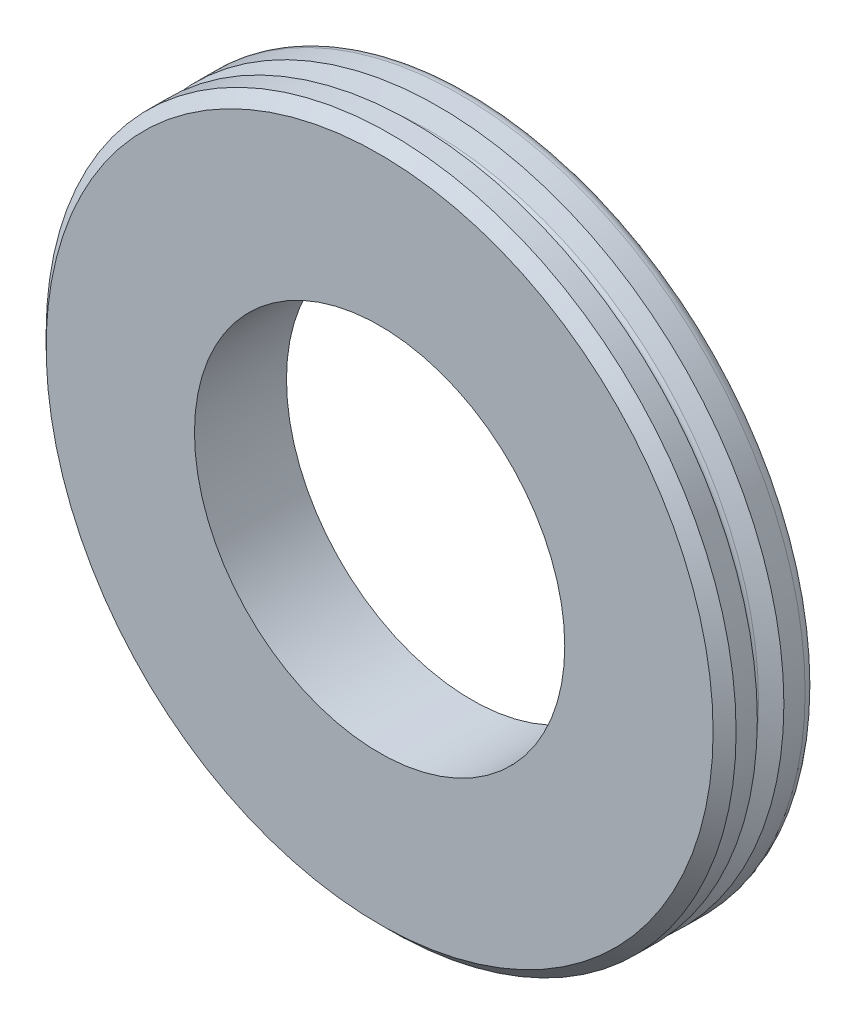
ISO-10303-21;
HEADER;
FILE_DESCRIPTION(('STEP AP214'),'2;1');
FILE_NAME('part.step','',(''),(''),'','','');
FILE_SCHEMA(('AUTOMOTIVE_DESIGN { 1 0 10303 214 1 1 1 1 }'));
ENDSEC;
DATA;
#1=APPLICATION_CONTEXT('core data for automotive mechanical design processes');
#2=APPLICATION_PROTOCOL_DEFINITION('international standard','automotive_design',2000,#1);
#3=PRODUCT_CONTEXT('',#1,'mechanical');
#4=PRODUCT('Part','Part','',(#3));
#5=PRODUCT_RELATED_PRODUCT_CATEGORY('part','',(#4));
#6=PRODUCT_DEFINITION_FORMATION('','',#4);
#7=PRODUCT_DEFINITION_CONTEXT('part definition',#1,'design');
#8=PRODUCT_DEFINITION('design','',#6,#7);
#9=PRODUCT_DEFINITION_SHAPE('','',#8);
#10=(LENGTH_UNIT() NAMED_UNIT(*) SI_UNIT(.MILLI.,.METRE.));
#11=(NAMED_UNIT(*) PLANE_ANGLE_UNIT() SI_UNIT($,.RADIAN.));
#12=(NAMED_UNIT(*) SI_UNIT($,.STERADIAN.) SOLID_ANGLE_UNIT());
#13=UNCERTAINTY_MEASURE_WITH_UNIT(LENGTH_MEASURE(1.E-05),#10,'distance_accuracy_value','');
#14=(GEOMETRIC_REPRESENTATION_CONTEXT(3) GLOBAL_UNCERTAINTY_ASSIGNED_CONTEXT((#13)) GLOBAL_UNIT_ASSIGNED_CONTEXT((#10,
#11,#12)) REPRESENTATION_CONTEXT('',''));
#15=CARTESIAN_POINT('',(0.,0.,0.));
#16=DIRECTION('',(0.,0.,1.));
#17=DIRECTION('',(1.,0.,0.));
#18=AXIS2_PLACEMENT_3D('',#15,#16,#17);
#19=CARTESIAN_POINT('',(0.,0.,2.));
#20=DIRECTION('',(0.,0.,-1.));
#21=DIRECTION('',(-1.,0.,0.));
#22=AXIS2_PLACEMENT_3D('',#19,#20,#21);
#23=CYLINDRICAL_SURFACE('',#22,15.);
#24=CARTESIAN_POINT('',(0.,0.,1.49999999999999));
#25=DIRECTION('',(0.,0.,1.));
#26=DIRECTION('',(1.,0.,0.));
#27=AXIS2_PLACEMENT_3D('',#24,#25,#26);
#28=CIRCLE('',#27,15.);
#29=CARTESIAN_POINT('',(15.,0.,1.49999999999999));
#30=VERTEX_POINT('',#29);
#31=EDGE_CURVE('E54',#30,#30,#28,.F.);
#32=ORIENTED_EDGE('',*,*,#31,.T.);
#33=EDGE_LOOP('',(#32));
#34=FACE_BOUND('',#33,.T.);
#35=CARTESIAN_POINT('',(0.,0.,0.577350269189624));
#36=DIRECTION('',(0.,0.,1.));
#37=DIRECTION('',(1.,0.,0.));
#38=AXIS2_PLACEMENT_3D('',#35,#36,#37);
#39=CIRCLE('',#38,15.);
#40=CARTESIAN_POINT('',(15.,0.,0.577350269189624));
#41=VERTEX_POINT('',#40);
#42=EDGE_CURVE('E79',#41,#41,#39,.T.);
#43=ORIENTED_EDGE('',*,*,#42,.T.);
#44=EDGE_LOOP('',(#43));
#45=FACE_BOUND('',#44,.T.);
#46=ADVANCED_FACE('F40',(#34,#45),#23,.T.);
#47=CARTESIAN_POINT('',(0.,0.,-1.5));
#48=DIRECTION('',(0.,0.,1.));
#49=DIRECTION('',(1.,0.,0.));
#50=AXIS2_PLACEMENT_3D('',#47,#48,#49);
#51=CIRCLE('',#50,15.);
#52=CARTESIAN_POINT('',(15.,0.,-1.5));
#53=VERTEX_POINT('',#52);
#54=EDGE_CURVE('E48',#53,#53,#51,.T.);
#55=ORIENTED_EDGE('',*,*,#54,.T.);
#56=EDGE_LOOP('',(#55));
#57=FACE_BOUND('',#56,.T.);
#58=CARTESIAN_POINT('',(0.,0.,-0.577350269189624));
#59=DIRECTION('',(0.,0.,1.));
#60=DIRECTION('',(1.,0.,0.));
#61=AXIS2_PLACEMENT_3D('',#58,#59,#60);
#62=CIRCLE('',#61,15.);
#63=CARTESIAN_POINT('',(15.,0.,-0.577350269189624));
#64=VERTEX_POINT('',#63);
#65=EDGE_CURVE('E86',#64,#64,#62,.T.);
#66=ORIENTED_EDGE('',*,*,#65,.F.);
#67=EDGE_LOOP('',(#66));
#68=FACE_BOUND('',#67,.T.);
#69=ADVANCED_FACE('F94',(#57,#68),#23,.T.);
#70=CARTESIAN_POINT('',(0.,0.,2.));
#71=DIRECTION('',(0.,0.,1.));
#72=DIRECTION('',(1.,0.,0.));
#73=AXIS2_PLACEMENT_3D('',#70,#71,#72);
#74=PLANE('',#73);
#75=CARTESIAN_POINT('',(0.,0.,2.));
#76=DIRECTION('',(0.,0.,1.));
#77=DIRECTION('',(1.,0.,0.));
#78=AXIS2_PLACEMENT_3D('',#75,#76,#77);
#79=CIRCLE('',#78,14.5);
#80=CARTESIAN_POINT('',(14.5,0.,2.));
#81=VERTEX_POINT('',#80);
#82=EDGE_CURVE('E60',#81,#81,#79,.T.);
#83=ORIENTED_EDGE('',*,*,#82,.T.);
#84=EDGE_LOOP('',(#83));
#85=FACE_BOUND('',#84,.T.);
#86=CARTESIAN_POINT('',(0.,0.,2.));
#87=DIRECTION('',(0.,0.,1.));
#88=DIRECTION('',(1.,0.,0.));
#89=AXIS2_PLACEMENT_3D('',#86,#87,#88);
#90=CIRCLE('',#89,8.05);
#91=CARTESIAN_POINT('',(8.05,0.,2.));
#92=VERTEX_POINT('',#91);
#93=EDGE_CURVE('E74',#92,#92,#90,.T.);
#94=ORIENTED_EDGE('',*,*,#93,.F.);
#95=EDGE_LOOP('',(#94));
#96=FACE_BOUND('',#95,.T.);
#97=ADVANCED_FACE('F96',(#85,#96),#74,.T.);
#98=CARTESIAN_POINT('',(0.,0.,-2.));
#99=DIRECTION('',(0.,0.,1.));
#100=DIRECTION('',(1.,0.,0.));
#101=AXIS2_PLACEMENT_3D('',#98,#99,#100);
#102=PLANE('',#101);
#103=CARTESIAN_POINT('',(0.,0.,-2.));
#104=DIRECTION('',(0.,0.,1.));
#105=DIRECTION('',(1.,0.,0.));
#106=AXIS2_PLACEMENT_3D('',#103,#104,#105);
#107=CIRCLE('',#106,14.5);
#108=CARTESIAN_POINT('',(14.5,0.,-2.));
#109=VERTEX_POINT('',#108);
#110=EDGE_CURVE('E10',#109,#109,#107,.F.);
#111=ORIENTED_EDGE('',*,*,#110,.T.);
#112=EDGE_LOOP('',(#111));
#113=FACE_BOUND('',#112,.T.);
#114=CARTESIAN_POINT('',(0.,0.,-2.));
#115=DIRECTION('',(0.,0.,1.));
#116=DIRECTION('',(1.,0.,0.));
#117=AXIS2_PLACEMENT_3D('',#114,#115,#116);
#118=CIRCLE('',#117,8.05);
#119=CARTESIAN_POINT('',(8.05,0.,-2.));
#120=VERTEX_POINT('',#119);
#121=EDGE_CURVE('E75',#120,#120,#118,.T.);
#122=ORIENTED_EDGE('',*,*,#121,.T.);
#123=EDGE_LOOP('',(#122));
#124=FACE_BOUND('',#123,.T.);
#125=ADVANCED_FACE('F102',(#113,#124),#102,.F.);
#126=CARTESIAN_POINT('',(0.,0.,2.));
#127=DIRECTION('',(0.,0.,-1.));
#128=DIRECTION('',(-1.,0.,0.));
#129=AXIS2_PLACEMENT_3D('',#126,#127,#128);
#130=CYLINDRICAL_SURFACE('',#129,8.05);
#131=ORIENTED_EDGE('',*,*,#93,.T.);
#132=EDGE_LOOP('',(#131));
#133=FACE_BOUND('',#132,.T.);
#134=ORIENTED_EDGE('',*,*,#121,.F.);
#135=EDGE_LOOP('',(#134));
#136=FACE_BOUND('',#135,.T.);
#137=ADVANCED_FACE('F127',(#133,#136),#130,.F.);
#138=CARTESIAN_POINT('',(0.,0.,0.577350269189624));
#139=DIRECTION('',(0.,0.,1.));
#140=DIRECTION('',(1.,0.,0.));
#141=AXIS2_PLACEMENT_3D('',#138,#139,#140);
#142=CONICAL_SURFACE('',#141,15.,1.0471975511966);
#143=CARTESIAN_POINT('',(0.,0.,0.173205080756886));
#144=DIRECTION('',(0.,0.,1.));
#145=DIRECTION('',(1.,0.,0.));
#146=AXIS2_PLACEMENT_3D('',#143,#144,#145);
#147=CIRCLE('',#146,14.3);
#148=CARTESIAN_POINT('',(14.3,0.,0.173205080756886));
#149=VERTEX_POINT('',#148);
#150=EDGE_CURVE('E70',#149,#149,#147,.T.);
#151=ORIENTED_EDGE('',*,*,#150,.T.);
#152=EDGE_LOOP('',(#151));
#153=FACE_BOUND('',#152,.T.);
#154=ORIENTED_EDGE('',*,*,#42,.F.);
#155=EDGE_LOOP('',(#154));
#156=FACE_BOUND('',#155,.T.);
#157=ADVANCED_FACE('F130',(#153,#156),#142,.T.);
#158=CARTESIAN_POINT('',(0.,0.,0.));
#159=DIRECTION('',(0.,0.,-1.));
#160=DIRECTION('',(-1.,0.,0.));
#161=AXIS2_PLACEMENT_3D('',#158,#159,#160);
#162=CONICAL_SURFACE('',#161,14.,1.0471975511966);
#163=CARTESIAN_POINT('',(0.,0.,-0.173205080756886));
#164=DIRECTION('',(0.,0.,-1.));
#165=DIRECTION('',(-1.,0.,0.));
#166=AXIS2_PLACEMENT_3D('',#163,#164,#165);
#167=CIRCLE('',#166,14.3);
#168=CARTESIAN_POINT('',(-14.3,0.,-0.173205080756886));
#169=VERTEX_POINT('',#168);
#170=EDGE_CURVE('E66',#169,#169,#167,.T.);
#171=ORIENTED_EDGE('',*,*,#170,.T.);
#172=EDGE_LOOP('',(#171));
#173=FACE_BOUND('',#172,.T.);
#174=ORIENTED_EDGE('',*,*,#65,.T.);
#175=EDGE_LOOP('',(#174));
#176=FACE_BOUND('',#175,.T.);
#177=ADVANCED_FACE('F92',(#173,#176),#162,.T.);
#178=CARTESIAN_POINT('',(0.,0.,0.));
#179=DIRECTION('',(0.,0.,1.));
#180=DIRECTION('',(1.,0.,0.));
#181=AXIS2_PLACEMENT_3D('',#178,#179,#180);
#182=TOROIDAL_SURFACE('',#181,14.4,0.2);
#183=ORIENTED_EDGE('',*,*,#170,.F.);
#184=EDGE_LOOP('',(#183));
#185=FACE_BOUND('',#184,.T.);
#186=ORIENTED_EDGE('',*,*,#150,.F.);
#187=EDGE_LOOP('',(#186));
#188=FACE_BOUND('',#187,.T.);
#189=ADVANCED_FACE('F108',(#185,#188),#182,.F.);
#190=CARTESIAN_POINT('',(0.,0.,2.));
#191=DIRECTION('',(0.,0.,-1.));
#192=DIRECTION('',(-1.,0.,0.));
#193=AXIS2_PLACEMENT_3D('',#190,#191,#192);
#194=CONICAL_SURFACE('',#193,14.5,0.785398163397443);
#195=ORIENTED_EDGE('',*,*,#31,.F.);
#196=EDGE_LOOP('',(#195));
#197=FACE_BOUND('',#196,.T.);
#198=ORIENTED_EDGE('',*,*,#82,.F.);
#199=EDGE_LOOP('',(#198));
#200=FACE_BOUND('',#199,.T.);
#201=ADVANCED_FACE('F110',(#197,#200),#194,.T.);
#202=CARTESIAN_POINT('',(0.,0.,-1.5));
#203=DIRECTION('',(0.,0.,1.));
#204=DIRECTION('',(1.,0.,0.));
#205=AXIS2_PLACEMENT_3D('',#202,#203,#204);
#206=TOROIDAL_SURFACE('',#205,14.5,0.5);
#207=ORIENTED_EDGE('',*,*,#110,.F.);
#208=EDGE_LOOP('',(#207));
#209=FACE_BOUND('',#208,.T.);
#210=ORIENTED_EDGE('',*,*,#54,.F.);
#211=EDGE_LOOP('',(#210));
#212=FACE_BOUND('',#211,.T.);
#213=ADVANCED_FACE('F42',(#209,#212),#206,.T.);
#214=CLOSED_SHELL('',(#46,#69,#97,#125,#137,#157,#177,#189,#201,#213));
#215=MANIFOLD_SOLID_BREP('B2',#214);
#216=ADVANCED_BREP_SHAPE_REPRESENTATION('',(#18,#215),#14);
#217=SHAPE_DEFINITION_REPRESENTATION(#9,#216);
ENDSEC;
END-ISO-10303-21;
